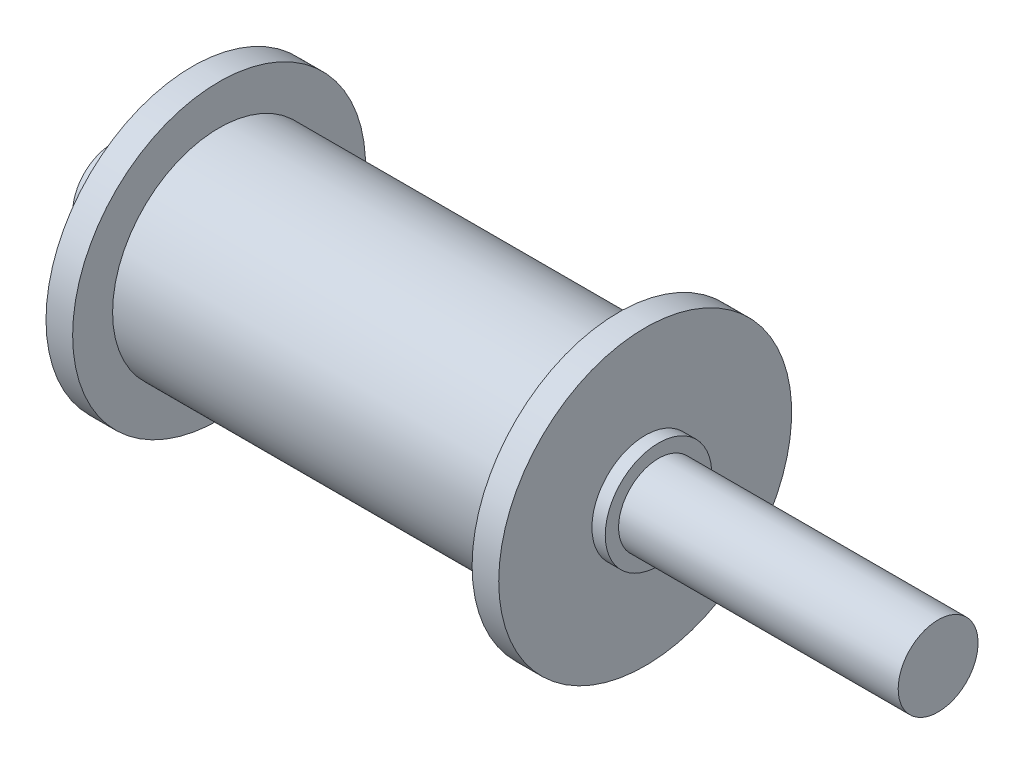
ISO-10303-21;
HEADER;
FILE_DESCRIPTION(('STEP AP214'),'2;1');
FILE_NAME('part.step','',(''),(''),'','','');
FILE_SCHEMA(('AUTOMOTIVE_DESIGN { 1 0 10303 214 1 1 1 1 }'));
ENDSEC;
DATA;
#1=APPLICATION_CONTEXT('core data for automotive mechanical design processes');
#2=APPLICATION_PROTOCOL_DEFINITION('international standard','automotive_design',2000,#1);
#3=PRODUCT_CONTEXT('',#1,'mechanical');
#4=PRODUCT('Part','Part','',(#3));
#5=PRODUCT_RELATED_PRODUCT_CATEGORY('part','',(#4));
#6=PRODUCT_DEFINITION_FORMATION('','',#4);
#7=PRODUCT_DEFINITION_CONTEXT('part definition',#1,'design');
#8=PRODUCT_DEFINITION('design','',#6,#7);
#9=PRODUCT_DEFINITION_SHAPE('','',#8);
#10=(LENGTH_UNIT() NAMED_UNIT(*) SI_UNIT(.MILLI.,.METRE.));
#11=(NAMED_UNIT(*) PLANE_ANGLE_UNIT() SI_UNIT($,.RADIAN.));
#12=(NAMED_UNIT(*) SI_UNIT($,.STERADIAN.) SOLID_ANGLE_UNIT());
#13=UNCERTAINTY_MEASURE_WITH_UNIT(LENGTH_MEASURE(1.E-05),#10,'distance_accuracy_value','');
#14=(GEOMETRIC_REPRESENTATION_CONTEXT(3) GLOBAL_UNCERTAINTY_ASSIGNED_CONTEXT((#13)) GLOBAL_UNIT_ASSIGNED_CONTEXT((#10,
#11,#12)) REPRESENTATION_CONTEXT('',''));
#15=CARTESIAN_POINT('',(0.,0.,0.));
#16=DIRECTION('',(0.,0.,1.));
#17=DIRECTION('',(1.,0.,0.));
#18=AXIS2_PLACEMENT_3D('',#15,#16,#17);
#19=CARTESIAN_POINT('',(-1.,3.,0.));
#20=DIRECTION('',(1.,0.,0.));
#21=DIRECTION('',(0.,0.,-1.));
#22=AXIS2_PLACEMENT_3D('',#19,#20,#21);
#23=PLANE('',#22);
#24=CARTESIAN_POINT('',(-1.,0.,0.));
#25=DIRECTION('',(-1.,0.,0.));
#26=DIRECTION('',(0.,0.,1.));
#27=AXIS2_PLACEMENT_3D('',#24,#25,#26);
#28=CIRCLE('',#27,3.);
#29=CARTESIAN_POINT('',(-1.,0.,3.));
#30=VERTEX_POINT('',#29);
#31=EDGE_CURVE('E91',#30,#30,#28,.T.);
#32=ORIENTED_EDGE('',*,*,#31,.F.);
#33=EDGE_LOOP('',(#32));
#34=FACE_BOUND('',#33,.T.);
#35=CARTESIAN_POINT('',(-1.,0.,0.));
#36=DIRECTION('',(-1.,0.,0.));
#37=DIRECTION('',(0.,0.,1.));
#38=AXIS2_PLACEMENT_3D('',#35,#36,#37);
#39=CIRCLE('',#38,4.);
#40=CARTESIAN_POINT('',(-1.,0.,4.));
#41=VERTEX_POINT('',#40);
#42=EDGE_CURVE('E12',#41,#41,#39,.T.);
#43=ORIENTED_EDGE('',*,*,#42,.T.);
#44=EDGE_LOOP('',(#43));
#45=FACE_BOUND('',#44,.T.);
#46=ADVANCED_FACE('F45',(#34,#45),#23,.F.);
#47=CARTESIAN_POINT('',(-6.,0.,0.));
#48=DIRECTION('',(-1.,0.,0.));
#49=DIRECTION('',(0.,0.,1.));
#50=AXIS2_PLACEMENT_3D('',#47,#48,#49);
#51=CYLINDRICAL_SURFACE('',#50,4.);
#52=ORIENTED_EDGE('',*,*,#42,.F.);
#53=EDGE_LOOP('',(#52));
#54=FACE_BOUND('',#53,.T.);
#55=CARTESIAN_POINT('',(0.,0.,0.));
#56=DIRECTION('',(-1.,0.,0.));
#57=DIRECTION('',(0.,0.,1.));
#58=AXIS2_PLACEMENT_3D('',#55,#56,#57);
#59=CIRCLE('',#58,4.);
#60=CARTESIAN_POINT('',(0.,0.,4.));
#61=VERTEX_POINT('',#60);
#62=EDGE_CURVE('E51',#61,#61,#59,.T.);
#63=ORIENTED_EDGE('',*,*,#62,.T.);
#64=EDGE_LOOP('',(#63));
#65=FACE_BOUND('',#64,.T.);
#66=ADVANCED_FACE('F98',(#54,#65),#51,.T.);
#67=CARTESIAN_POINT('',(0.,4.,0.));
#68=DIRECTION('',(1.,0.,0.));
#69=DIRECTION('',(0.,0.,-1.));
#70=AXIS2_PLACEMENT_3D('',#67,#68,#69);
#71=PLANE('',#70);
#72=ORIENTED_EDGE('',*,*,#62,.F.);
#73=EDGE_LOOP('',(#72));
#74=FACE_BOUND('',#73,.T.);
#75=CARTESIAN_POINT('',(0.,0.,0.));
#76=DIRECTION('',(-1.,0.,0.));
#77=DIRECTION('',(0.,0.,1.));
#78=AXIS2_PLACEMENT_3D('',#75,#76,#77);
#79=CIRCLE('',#78,11.);
#80=CARTESIAN_POINT('',(0.,0.,11.));
#81=VERTEX_POINT('',#80);
#82=EDGE_CURVE('E55',#81,#81,#79,.T.);
#83=ORIENTED_EDGE('',*,*,#82,.T.);
#84=EDGE_LOOP('',(#83));
#85=FACE_BOUND('',#84,.T.);
#86=ADVANCED_FACE('F102',(#74,#85),#71,.F.);
#87=CARTESIAN_POINT('',(-6.,0.,0.));
#88=DIRECTION('',(-1.,0.,0.));
#89=DIRECTION('',(0.,0.,1.));
#90=AXIS2_PLACEMENT_3D('',#87,#88,#89);
#91=CYLINDRICAL_SURFACE('',#90,11.);
#92=ORIENTED_EDGE('',*,*,#82,.F.);
#93=EDGE_LOOP('',(#92));
#94=FACE_BOUND('',#93,.T.);
#95=CARTESIAN_POINT('',(2.,0.,0.));
#96=DIRECTION('',(-1.,0.,0.));
#97=DIRECTION('',(0.,0.,1.));
#98=AXIS2_PLACEMENT_3D('',#95,#96,#97);
#99=CIRCLE('',#98,11.);
#100=CARTESIAN_POINT('',(2.,0.,11.));
#101=VERTEX_POINT('',#100);
#102=EDGE_CURVE('E59',#101,#101,#99,.T.);
#103=ORIENTED_EDGE('',*,*,#102,.T.);
#104=EDGE_LOOP('',(#103));
#105=FACE_BOUND('',#104,.T.);
#106=ADVANCED_FACE('F107',(#94,#105),#91,.T.);
#107=CARTESIAN_POINT('',(2.,11.,0.));
#108=DIRECTION('',(-1.,0.,0.));
#109=DIRECTION('',(0.,0.,1.));
#110=AXIS2_PLACEMENT_3D('',#107,#108,#109);
#111=PLANE('',#110);
#112=ORIENTED_EDGE('',*,*,#102,.F.);
#113=EDGE_LOOP('',(#112));
#114=FACE_BOUND('',#113,.T.);
#115=CARTESIAN_POINT('',(2.,0.,0.));
#116=DIRECTION('',(-1.,0.,0.));
#117=DIRECTION('',(0.,0.,1.));
#118=AXIS2_PLACEMENT_3D('',#115,#116,#117);
#119=CIRCLE('',#118,8.);
#120=CARTESIAN_POINT('',(2.,0.,8.));
#121=VERTEX_POINT('',#120);
#122=EDGE_CURVE('E64',#121,#121,#119,.T.);
#123=ORIENTED_EDGE('',*,*,#122,.T.);
#124=EDGE_LOOP('',(#123));
#125=FACE_BOUND('',#124,.T.);
#126=ADVANCED_FACE('F113',(#114,#125),#111,.F.);
#127=CARTESIAN_POINT('',(-6.,0.,0.));
#128=DIRECTION('',(-1.,0.,0.));
#129=DIRECTION('',(0.,0.,1.));
#130=AXIS2_PLACEMENT_3D('',#127,#128,#129);
#131=CYLINDRICAL_SURFACE('',#130,8.);
#132=ORIENTED_EDGE('',*,*,#122,.F.);
#133=EDGE_LOOP('',(#132));
#134=FACE_BOUND('',#133,.T.);
#135=CARTESIAN_POINT('',(32.,0.,0.));
#136=DIRECTION('',(-1.,0.,0.));
#137=DIRECTION('',(0.,0.,1.));
#138=AXIS2_PLACEMENT_3D('',#135,#136,#137);
#139=CIRCLE('',#138,8.);
#140=CARTESIAN_POINT('',(32.,0.,8.));
#141=VERTEX_POINT('',#140);
#142=EDGE_CURVE('E67',#141,#141,#139,.T.);
#143=ORIENTED_EDGE('',*,*,#142,.T.);
#144=EDGE_LOOP('',(#143));
#145=FACE_BOUND('',#144,.T.);
#146=ADVANCED_FACE('F117',(#134,#145),#131,.T.);
#147=CARTESIAN_POINT('',(32.,11.,0.));
#148=DIRECTION('',(1.,0.,0.));
#149=DIRECTION('',(0.,0.,-1.));
#150=AXIS2_PLACEMENT_3D('',#147,#148,#149);
#151=PLANE('',#150);
#152=ORIENTED_EDGE('',*,*,#142,.F.);
#153=EDGE_LOOP('',(#152));
#154=FACE_BOUND('',#153,.T.);
#155=CARTESIAN_POINT('',(32.,0.,0.));
#156=DIRECTION('',(-1.,0.,0.));
#157=DIRECTION('',(0.,0.,1.));
#158=AXIS2_PLACEMENT_3D('',#155,#156,#157);
#159=CIRCLE('',#158,11.);
#160=CARTESIAN_POINT('',(32.,0.,11.));
#161=VERTEX_POINT('',#160);
#162=EDGE_CURVE('E70',#161,#161,#159,.T.);
#163=ORIENTED_EDGE('',*,*,#162,.T.);
#164=EDGE_LOOP('',(#163));
#165=FACE_BOUND('',#164,.T.);
#166=ADVANCED_FACE('F121',(#154,#165),#151,.F.);
#167=CARTESIAN_POINT('',(-6.,0.,0.));
#168=DIRECTION('',(-1.,0.,0.));
#169=DIRECTION('',(0.,0.,1.));
#170=AXIS2_PLACEMENT_3D('',#167,#168,#169);
#171=CYLINDRICAL_SURFACE('',#170,11.);
#172=ORIENTED_EDGE('',*,*,#162,.F.);
#173=EDGE_LOOP('',(#172));
#174=FACE_BOUND('',#173,.T.);
#175=CARTESIAN_POINT('',(34.,0.,0.));
#176=DIRECTION('',(-1.,0.,0.));
#177=DIRECTION('',(0.,0.,1.));
#178=AXIS2_PLACEMENT_3D('',#175,#176,#177);
#179=CIRCLE('',#178,11.);
#180=CARTESIAN_POINT('',(34.,0.,11.));
#181=VERTEX_POINT('',#180);
#182=EDGE_CURVE('E73',#181,#181,#179,.T.);
#183=ORIENTED_EDGE('',*,*,#182,.T.);
#184=EDGE_LOOP('',(#183));
#185=FACE_BOUND('',#184,.T.);
#186=ADVANCED_FACE('F125',(#174,#185),#171,.T.);
#187=CARTESIAN_POINT('',(34.,4.,0.));
#188=DIRECTION('',(-1.,0.,0.));
#189=DIRECTION('',(0.,0.,1.));
#190=AXIS2_PLACEMENT_3D('',#187,#188,#189);
#191=PLANE('',#190);
#192=ORIENTED_EDGE('',*,*,#182,.F.);
#193=EDGE_LOOP('',(#192));
#194=FACE_BOUND('',#193,.T.);
#195=CARTESIAN_POINT('',(34.,0.,0.));
#196=DIRECTION('',(-1.,0.,0.));
#197=DIRECTION('',(0.,0.,1.));
#198=AXIS2_PLACEMENT_3D('',#195,#196,#197);
#199=CIRCLE('',#198,4.);
#200=CARTESIAN_POINT('',(34.,0.,4.));
#201=VERTEX_POINT('',#200);
#202=EDGE_CURVE('E76',#201,#201,#199,.T.);
#203=ORIENTED_EDGE('',*,*,#202,.T.);
#204=EDGE_LOOP('',(#203));
#205=FACE_BOUND('',#204,.T.);
#206=ADVANCED_FACE('F129',(#194,#205),#191,.F.);
#207=CARTESIAN_POINT('',(-6.,0.,0.));
#208=DIRECTION('',(-1.,0.,0.));
#209=DIRECTION('',(0.,0.,1.));
#210=AXIS2_PLACEMENT_3D('',#207,#208,#209);
#211=CYLINDRICAL_SURFACE('',#210,4.);
#212=ORIENTED_EDGE('',*,*,#202,.F.);
#213=EDGE_LOOP('',(#212));
#214=FACE_BOUND('',#213,.T.);
#215=CARTESIAN_POINT('',(35.,0.,0.));
#216=DIRECTION('',(-1.,0.,0.));
#217=DIRECTION('',(0.,0.,1.));
#218=AXIS2_PLACEMENT_3D('',#215,#216,#217);
#219=CIRCLE('',#218,4.);
#220=CARTESIAN_POINT('',(35.,0.,4.));
#221=VERTEX_POINT('',#220);
#222=EDGE_CURVE('E79',#221,#221,#219,.T.);
#223=ORIENTED_EDGE('',*,*,#222,.T.);
#224=EDGE_LOOP('',(#223));
#225=FACE_BOUND('',#224,.T.);
#226=ADVANCED_FACE('F133',(#214,#225),#211,.T.);
#227=CARTESIAN_POINT('',(35.,4.,0.));
#228=DIRECTION('',(-1.,0.,0.));
#229=DIRECTION('',(0.,0.,1.));
#230=AXIS2_PLACEMENT_3D('',#227,#228,#229);
#231=PLANE('',#230);
#232=ORIENTED_EDGE('',*,*,#222,.F.);
#233=EDGE_LOOP('',(#232));
#234=FACE_BOUND('',#233,.T.);
#235=CARTESIAN_POINT('',(35.,0.,0.));
#236=DIRECTION('',(-1.,0.,0.));
#237=DIRECTION('',(0.,0.,1.));
#238=AXIS2_PLACEMENT_3D('',#235,#236,#237);
#239=CIRCLE('',#238,3.);
#240=CARTESIAN_POINT('',(35.,0.,3.));
#241=VERTEX_POINT('',#240);
#242=EDGE_CURVE('E82',#241,#241,#239,.T.);
#243=ORIENTED_EDGE('',*,*,#242,.T.);
#244=EDGE_LOOP('',(#243));
#245=FACE_BOUND('',#244,.T.);
#246=ADVANCED_FACE('F137',(#234,#245),#231,.F.);
#247=CARTESIAN_POINT('',(-6.,0.,0.));
#248=DIRECTION('',(-1.,0.,0.));
#249=DIRECTION('',(0.,0.,1.));
#250=AXIS2_PLACEMENT_3D('',#247,#248,#249);
#251=CYLINDRICAL_SURFACE('',#250,3.);
#252=ORIENTED_EDGE('',*,*,#242,.F.);
#253=EDGE_LOOP('',(#252));
#254=FACE_BOUND('',#253,.T.);
#255=CARTESIAN_POINT('',(56.,0.,0.));
#256=DIRECTION('',(-1.,0.,0.));
#257=DIRECTION('',(0.,0.,1.));
#258=AXIS2_PLACEMENT_3D('',#255,#256,#257);
#259=CIRCLE('',#258,3.);
#260=CARTESIAN_POINT('',(56.,0.,3.));
#261=VERTEX_POINT('',#260);
#262=EDGE_CURVE('E85',#261,#261,#259,.T.);
#263=ORIENTED_EDGE('',*,*,#262,.T.);
#264=EDGE_LOOP('',(#263));
#265=FACE_BOUND('',#264,.T.);
#266=ADVANCED_FACE('F141',(#254,#265),#251,.T.);
#267=CARTESIAN_POINT('',(56.,3.,0.));
#268=DIRECTION('',(-1.,0.,0.));
#269=DIRECTION('',(0.,0.,1.));
#270=AXIS2_PLACEMENT_3D('',#267,#268,#269);
#271=PLANE('',#270);
#272=ORIENTED_EDGE('',*,*,#262,.F.);
#273=EDGE_LOOP('',(#272));
#274=FACE_BOUND('',#273,.T.);
#275=ADVANCED_FACE('F145',(#274),#271,.F.);
#276=CARTESIAN_POINT('',(-6.,3.,0.));
#277=DIRECTION('',(1.,0.,0.));
#278=DIRECTION('',(0.,0.,-1.));
#279=AXIS2_PLACEMENT_3D('',#276,#277,#278);
#280=PLANE('',#279);
#281=CARTESIAN_POINT('',(-6.,0.,0.));
#282=DIRECTION('',(-1.,0.,0.));
#283=DIRECTION('',(0.,0.,1.));
#284=AXIS2_PLACEMENT_3D('',#281,#282,#283);
#285=CIRCLE('',#284,3.);
#286=CARTESIAN_POINT('',(-6.,0.,3.));
#287=VERTEX_POINT('',#286);
#288=EDGE_CURVE('E88',#287,#287,#285,.T.);
#289=ORIENTED_EDGE('',*,*,#288,.T.);
#290=EDGE_LOOP('',(#289));
#291=FACE_BOUND('',#290,.T.);
#292=ADVANCED_FACE('F149',(#291),#280,.F.);
#293=CARTESIAN_POINT('',(-6.,0.,0.));
#294=DIRECTION('',(-1.,0.,0.));
#295=DIRECTION('',(0.,0.,1.));
#296=AXIS2_PLACEMENT_3D('',#293,#294,#295);
#297=CYLINDRICAL_SURFACE('',#296,3.);
#298=ORIENTED_EDGE('',*,*,#288,.F.);
#299=EDGE_LOOP('',(#298));
#300=FACE_BOUND('',#299,.T.);
#301=ORIENTED_EDGE('',*,*,#31,.T.);
#302=EDGE_LOOP('',(#301));
#303=FACE_BOUND('',#302,.T.);
#304=ADVANCED_FACE('F95',(#300,#303),#297,.T.);
#305=CLOSED_SHELL('',(#46,#66,#86,#106,#126,#146,#166,#186,#206,#226,#246,#266,#275,#292,#304));
#306=MANIFOLD_SOLID_BREP('B2',#305);
#307=ADVANCED_BREP_SHAPE_REPRESENTATION('',(#18,#306),#14);
#308=SHAPE_DEFINITION_REPRESENTATION(#9,#307);
ENDSEC;
END-ISO-10303-21;
